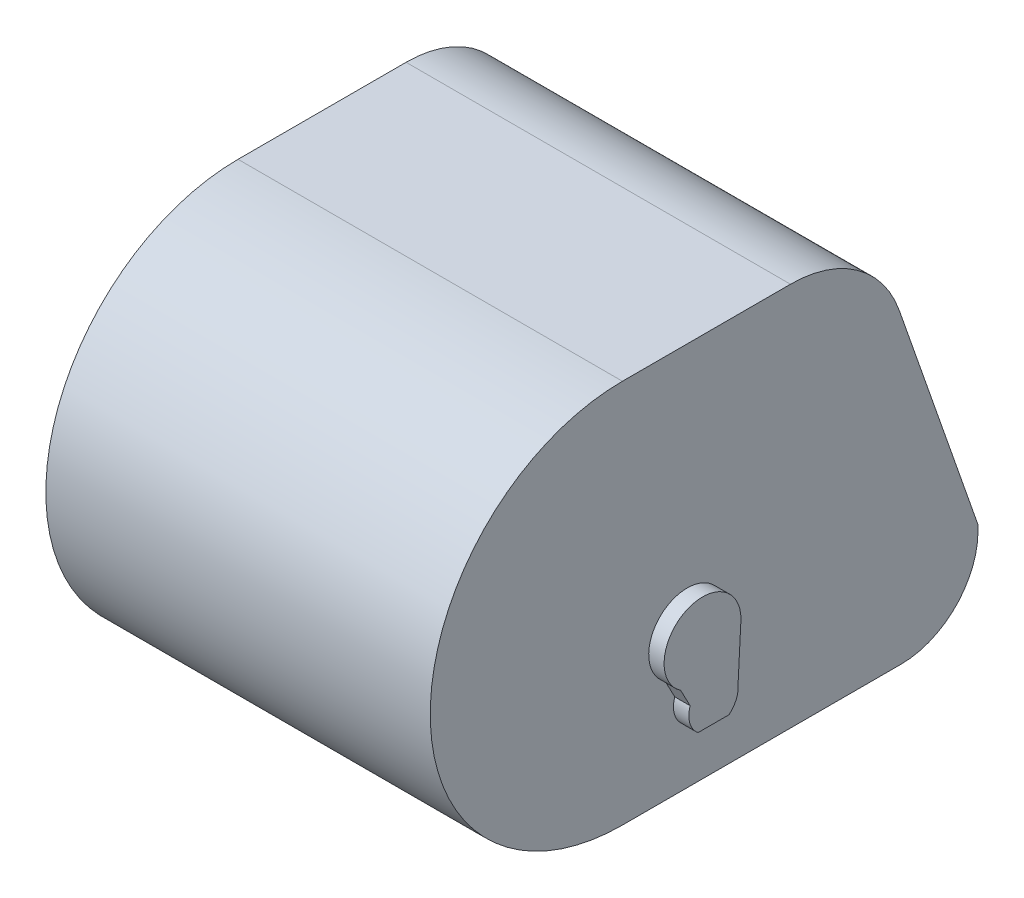
ISO-10303-21;
HEADER;
FILE_DESCRIPTION(('STEP AP214'),'2;1');
FILE_NAME('part.step','',(''),(''),'','','');
FILE_SCHEMA(('AUTOMOTIVE_DESIGN { 1 0 10303 214 1 1 1 1 }'));
ENDSEC;
DATA;
#1=APPLICATION_CONTEXT('core data for automotive mechanical design processes');
#2=APPLICATION_PROTOCOL_DEFINITION('international standard','automotive_design',2000,#1);
#3=PRODUCT_CONTEXT('',#1,'mechanical');
#4=PRODUCT('Part','Part','',(#3));
#5=PRODUCT_RELATED_PRODUCT_CATEGORY('part','',(#4));
#6=PRODUCT_DEFINITION_FORMATION('','',#4);
#7=PRODUCT_DEFINITION_CONTEXT('part definition',#1,'design');
#8=PRODUCT_DEFINITION('design','',#6,#7);
#9=PRODUCT_DEFINITION_SHAPE('','',#8);
#10=(LENGTH_UNIT() NAMED_UNIT(*) SI_UNIT(.MILLI.,.METRE.));
#11=(NAMED_UNIT(*) PLANE_ANGLE_UNIT() SI_UNIT($,.RADIAN.));
#12=(NAMED_UNIT(*) SI_UNIT($,.STERADIAN.) SOLID_ANGLE_UNIT());
#13=UNCERTAINTY_MEASURE_WITH_UNIT(LENGTH_MEASURE(1.E-05),#10,'distance_accuracy_value','');
#14=(GEOMETRIC_REPRESENTATION_CONTEXT(3) GLOBAL_UNCERTAINTY_ASSIGNED_CONTEXT((#13)) GLOBAL_UNIT_ASSIGNED_CONTEXT((#10,
#11,#12)) REPRESENTATION_CONTEXT('',''));
#15=CARTESIAN_POINT('',(0.,0.,0.));
#16=DIRECTION('',(0.,0.,1.));
#17=DIRECTION('',(1.,0.,0.));
#18=AXIS2_PLACEMENT_3D('',#15,#16,#17);
#19=CARTESIAN_POINT('',(-50.,0.,25.));
#20=DIRECTION('',(1.,0.,0.));
#21=DIRECTION('',(0.,0.,-1.));
#22=AXIS2_PLACEMENT_3D('',#19,#20,#21);
#23=CYLINDRICAL_SURFACE('',#22,50.);
#24=DIRECTION('',(1.,0.,0.));
#25=VECTOR('',#24,1.);
#26=CARTESIAN_POINT('',(-50.,-50.,25.));
#27=LINE('',#26,#25);
#28=CARTESIAN_POINT('',(-50.,-50.,25.));
#29=VERTEX_POINT('',#28);
#30=CARTESIAN_POINT('',(50.,-50.,25.));
#31=VERTEX_POINT('',#30);
#32=EDGE_CURVE('E348',#29,#31,#27,.T.);
#33=ORIENTED_EDGE('',*,*,#32,.T.);
#34=CARTESIAN_POINT('',(50.,0.,25.));
#35=DIRECTION('',(1.,0.,0.));
#36=DIRECTION('',(0.,0.,-1.));
#37=AXIS2_PLACEMENT_3D('',#34,#35,#36);
#38=CIRCLE('',#37,50.);
#39=CARTESIAN_POINT('',(50.,50.,25.));
#40=VERTEX_POINT('',#39);
#41=EDGE_CURVE('E313',#40,#31,#38,.T.);
#42=ORIENTED_EDGE('',*,*,#41,.F.);
#43=DIRECTION('',(1.,0.,0.));
#44=VECTOR('',#43,1.);
#45=CARTESIAN_POINT('',(-50.,50.,25.));
#46=LINE('',#45,#44);
#47=CARTESIAN_POINT('',(-50.,50.,25.));
#48=VERTEX_POINT('',#47);
#49=EDGE_CURVE('E349',#48,#40,#46,.T.);
#50=ORIENTED_EDGE('',*,*,#49,.F.);
#51=CARTESIAN_POINT('',(-50.,0.,25.));
#52=DIRECTION('',(1.,0.,0.));
#53=DIRECTION('',(0.,0.,-1.));
#54=AXIS2_PLACEMENT_3D('',#51,#52,#53);
#55=CIRCLE('',#54,50.);
#56=EDGE_CURVE('E330',#48,#29,#55,.T.);
#57=ORIENTED_EDGE('',*,*,#56,.T.);
#58=EDGE_LOOP('',(#33,#42,#50,#57));
#59=FACE_BOUND('',#58,.T.);
#60=ADVANCED_FACE('F47',(#59),#23,.T.);
#61=CARTESIAN_POINT('',(-50.,50.,0.));
#62=DIRECTION('',(0.,-1.,0.));
#63=DIRECTION('',(0.,0.,-1.));
#64=AXIS2_PLACEMENT_3D('',#61,#62,#63);
#65=PLANE('',#64);
#66=DIRECTION('',(0.,0.,-1.));
#67=VECTOR('',#66,1.);
#68=CARTESIAN_POINT('',(50.,50.,0.));
#69=LINE('',#68,#67);
#70=CARTESIAN_POINT('',(50.,50.,-18.7155698493744));
#71=VERTEX_POINT('',#70);
#72=EDGE_CURVE('E326',#40,#71,#69,.T.);
#73=ORIENTED_EDGE('',*,*,#72,.T.);
#74=DIRECTION('',(1.,0.,0.));
#75=VECTOR('',#74,1.);
#76=CARTESIAN_POINT('',(-50.,50.,-18.7155698493744));
#77=LINE('',#76,#75);
#78=CARTESIAN_POINT('',(-50.,50.,-18.7155698493744));
#79=VERTEX_POINT('',#78);
#80=EDGE_CURVE('E365',#71,#79,#77,.F.);
#81=ORIENTED_EDGE('',*,*,#80,.T.);
#82=DIRECTION('',(0.,0.,-1.));
#83=VECTOR('',#82,1.);
#84=CARTESIAN_POINT('',(-50.,50.,0.));
#85=LINE('',#84,#83);
#86=EDGE_CURVE('E344',#48,#79,#85,.T.);
#87=ORIENTED_EDGE('',*,*,#86,.F.);
#88=ORIENTED_EDGE('',*,*,#49,.T.);
#89=EDGE_LOOP('',(#73,#81,#87,#88));
#90=FACE_BOUND('',#89,.T.);
#91=ADVANCED_FACE('F408',(#90),#65,.F.);
#92=CARTESIAN_POINT('',(-50.,17.9287305122494,-51.2249443207127));
#93=DIRECTION('',(0.,-0.330350424728106,0.943858356366017));
#94=DIRECTION('',(0.,-0.943858356366017,-0.330350424728106));
#95=AXIS2_PLACEMENT_3D('',#92,#93,#94);
#96=PLANE('',#95);
#97=DIRECTION('',(0.,-0.943858356366018,-0.330350424728106));
#98=VECTOR('',#97,1.);
#99=CARTESIAN_POINT('',(-50.,17.9287305122494,-51.2249443207127));
#100=LINE('',#99,#98);
#101=CARTESIAN_POINT('',(-50.,29.9105127418432,-47.0313205403549));
#102=VERTEX_POINT('',#101);
#103=CARTESIAN_POINT('',(-50.,-28.5714285714286,-67.5));
#104=VERTEX_POINT('',#103);
#105=EDGE_CURVE('E341',#102,#104,#100,.T.);
#106=ORIENTED_EDGE('',*,*,#105,.F.);
#107=DIRECTION('',(1.,0.,0.));
#108=VECTOR('',#107,1.);
#109=CARTESIAN_POINT('',(-50.,29.9105127418432,-47.0313205403549));
#110=LINE('',#109,#108);
#111=CARTESIAN_POINT('',(50.,29.9105127418432,-47.0313205403549));
#112=VERTEX_POINT('',#111);
#113=EDGE_CURVE('E352',#102,#112,#110,.T.);
#114=ORIENTED_EDGE('',*,*,#113,.T.);
#115=DIRECTION('',(0.,-0.943858356366018,-0.330350424728106));
#116=VECTOR('',#115,1.);
#117=CARTESIAN_POINT('',(50.,17.9287305122494,-51.2249443207127));
#118=LINE('',#117,#116);
#119=CARTESIAN_POINT('',(50.,-28.5714285714286,-67.5));
#120=VERTEX_POINT('',#119);
#121=EDGE_CURVE('E323',#112,#120,#118,.T.);
#122=ORIENTED_EDGE('',*,*,#121,.T.);
#123=DIRECTION('',(1.,0.,0.));
#124=VECTOR('',#123,1.);
#125=CARTESIAN_POINT('',(-50.,-28.5714285714286,-67.5));
#126=LINE('',#125,#124);
#127=EDGE_CURVE('E353',#104,#120,#126,.T.);
#128=ORIENTED_EDGE('',*,*,#127,.F.);
#129=EDGE_LOOP('',(#106,#114,#122,#128));
#130=FACE_BOUND('',#129,.T.);
#131=ADVANCED_FACE('F414',(#130),#96,.F.);
#132=CARTESIAN_POINT('',(-50.,0.,-67.5));
#133=DIRECTION('',(0.,0.,1.));
#134=DIRECTION('',(0.,-1.,0.));
#135=AXIS2_PLACEMENT_3D('',#132,#133,#134);
#136=PLANE('',#135);
#137=DIRECTION('',(0.,-1.,0.));
#138=VECTOR('',#137,1.);
#139=CARTESIAN_POINT('',(50.,0.,-67.5));
#140=LINE('',#139,#138);
#141=CARTESIAN_POINT('',(50.,-30.,-67.5));
#142=VERTEX_POINT('',#141);
#143=EDGE_CURVE('E320',#120,#142,#140,.T.);
#144=ORIENTED_EDGE('',*,*,#143,.T.);
#145=DIRECTION('',(1.,0.,0.));
#146=VECTOR('',#145,1.);
#147=CARTESIAN_POINT('',(-50.,-30.,-67.5));
#148=LINE('',#147,#146);
#149=CARTESIAN_POINT('',(-50.,-30.,-67.5));
#150=VERTEX_POINT('',#149);
#151=EDGE_CURVE('E56',#142,#150,#148,.F.);
#152=ORIENTED_EDGE('',*,*,#151,.T.);
#153=DIRECTION('',(0.,-1.,0.));
#154=VECTOR('',#153,1.);
#155=CARTESIAN_POINT('',(-50.,0.,-67.5));
#156=LINE('',#155,#154);
#157=EDGE_CURVE('E338',#104,#150,#156,.T.);
#158=ORIENTED_EDGE('',*,*,#157,.F.);
#159=ORIENTED_EDGE('',*,*,#127,.T.);
#160=EDGE_LOOP('',(#144,#152,#158,#159));
#161=FACE_BOUND('',#160,.T.);
#162=ADVANCED_FACE('F444',(#161),#136,.F.);
#163=CARTESIAN_POINT('',(-50.,-50.,0.));
#164=DIRECTION('',(0.,-1.,0.));
#165=DIRECTION('',(0.,0.,-1.));
#166=AXIS2_PLACEMENT_3D('',#163,#164,#165);
#167=PLANE('',#166);
#168=DIRECTION('',(0.,0.,-1.));
#169=VECTOR('',#168,1.);
#170=CARTESIAN_POINT('',(-50.,-50.,0.));
#171=LINE('',#170,#169);
#172=CARTESIAN_POINT('',(-50.,-50.,-47.5));
#173=VERTEX_POINT('',#172);
#174=EDGE_CURVE('E334',#29,#173,#171,.T.);
#175=ORIENTED_EDGE('',*,*,#174,.T.);
#176=DIRECTION('',(1.,0.,0.));
#177=VECTOR('',#176,1.);
#178=CARTESIAN_POINT('',(50.,-50.,-47.5));
#179=LINE('',#178,#177);
#180=CARTESIAN_POINT('',(50.,-50.,-47.5));
#181=VERTEX_POINT('',#180);
#182=EDGE_CURVE('E371',#173,#181,#179,.T.);
#183=ORIENTED_EDGE('',*,*,#182,.T.);
#184=DIRECTION('',(0.,0.,-1.));
#185=VECTOR('',#184,1.);
#186=CARTESIAN_POINT('',(50.,-50.,0.));
#187=LINE('',#186,#185);
#188=EDGE_CURVE('E317',#31,#181,#187,.T.);
#189=ORIENTED_EDGE('',*,*,#188,.F.);
#190=ORIENTED_EDGE('',*,*,#32,.F.);
#191=EDGE_LOOP('',(#175,#183,#189,#190));
#192=FACE_BOUND('',#191,.T.);
#193=ADVANCED_FACE('F418',(#192),#167,.T.);
#194=CARTESIAN_POINT('',(-50.,0.,0.));
#195=DIRECTION('',(1.,0.,0.));
#196=DIRECTION('',(0.,0.,-1.));
#197=AXIS2_PLACEMENT_3D('',#194,#195,#196);
#198=PLANE('',#197);
#199=DIRECTION('',(0.,-0.998606059396649,0.0527819868543855));
#200=VECTOR('',#199,1.);
#201=CARTESIAN_POINT('',(-50.,-0.138617613155003,-2.62256873386694));
#202=LINE('',#201,#200);
#203=CARTESIAN_POINT('',(-50.,-15.,-1.83706049225424));
#204=VERTEX_POINT('',#203);
#205=CARTESIAN_POINT('',(-50.,-29.4030529426239,-1.07577755798092));
#206=VERTEX_POINT('',#205);
#207=EDGE_CURVE('E227',#204,#206,#202,.T.);
#208=ORIENTED_EDGE('',*,*,#207,.F.);
#209=CARTESIAN_POINT('',(-50.,-15.,8.16293950774576));
#210=DIRECTION('',(1.,0.,0.));
#211=DIRECTION('',(0.,0.,-1.));
#212=AXIS2_PLACEMENT_3D('',#209,#210,#211);
#213=CIRCLE('',#212,10.);
#214=CARTESIAN_POINT('',(-50.,-23.2277046201165,13.8466774225439));
#215=VERTEX_POINT('',#214);
#216=EDGE_CURVE('E186',#204,#215,#213,.T.);
#217=ORIENTED_EDGE('',*,*,#216,.T.);
#218=DIRECTION('',(0.,-0.885543277169393,-0.464556890229918));
#219=VECTOR('',#218,1.);
#220=CARTESIAN_POINT('',(-50.,-10.7091616290402,20.4139176151782));
#221=LINE('',#220,#219);
#222=CARTESIAN_POINT('',(-50.,-27.9239305604571,11.3830325901476));
#223=VERTEX_POINT('',#222);
#224=EDGE_CURVE('E208',#215,#223,#221,.T.);
#225=ORIENTED_EDGE('',*,*,#224,.T.);
#226=CARTESIAN_POINT('',(-50.,-30.,5.31229910997899));
#227=DIRECTION('',(1.,0.,0.));
#228=DIRECTION('',(0.,0.,-1.));
#229=AXIS2_PLACEMENT_3D('',#226,#227,#228);
#230=CIRCLE('',#229,6.41590751998841);
#231=CARTESIAN_POINT('',(-50.,-35.,9.33273059242509));
#232=VERTEX_POINT('',#231);
#233=EDGE_CURVE('E212',#223,#232,#230,.T.);
#234=ORIENTED_EDGE('',*,*,#233,.T.);
#235=DIRECTION('',(0.,0.,-1.));
#236=VECTOR('',#235,1.);
#237=CARTESIAN_POINT('',(-50.,-35.,0.));
#238=LINE('',#237,#236);
#239=CARTESIAN_POINT('',(-50.,-35.,1.29186762753289));
#240=VERTEX_POINT('',#239);
#241=EDGE_CURVE('E234',#232,#240,#238,.T.);
#242=ORIENTED_EDGE('',*,*,#241,.T.);
#243=EDGE_CURVE('E230',#240,#206,#230,.T.);
#244=ORIENTED_EDGE('',*,*,#243,.T.);
#245=EDGE_LOOP('',(#208,#217,#225,#234,#242,#244));
#246=FACE_BOUND('',#245,.T.);
#247=ORIENTED_EDGE('',*,*,#157,.T.);
#248=CARTESIAN_POINT('',(-50.,-30.,-47.5));
#249=DIRECTION('',(1.,0.,0.));
#250=DIRECTION('',(0.,0.,-1.));
#251=AXIS2_PLACEMENT_3D('',#248,#249,#250);
#252=CIRCLE('',#251,20.);
#253=EDGE_CURVE('E11',#150,#173,#252,.F.);
#254=ORIENTED_EDGE('',*,*,#253,.T.);
#255=ORIENTED_EDGE('',*,*,#174,.F.);
#256=ORIENTED_EDGE('',*,*,#56,.F.);
#257=ORIENTED_EDGE('',*,*,#86,.T.);
#258=CARTESIAN_POINT('',(-50.,20.,-18.7155698493744));
#259=DIRECTION('',(1.,0.,0.));
#260=DIRECTION('',(0.,0.,-1.));
#261=AXIS2_PLACEMENT_3D('',#258,#259,#260);
#262=CIRCLE('',#261,30.);
#263=EDGE_CURVE('E368',#79,#102,#262,.F.);
#264=ORIENTED_EDGE('',*,*,#263,.T.);
#265=ORIENTED_EDGE('',*,*,#105,.T.);
#266=EDGE_LOOP('',(#247,#254,#255,#256,#257,#264,#265));
#267=FACE_BOUND('',#266,.T.);
#268=ADVANCED_FACE('F391',(#246,#267),#198,.F.);
#269=CARTESIAN_POINT('',(50.,0.,0.));
#270=DIRECTION('',(1.,0.,0.));
#271=DIRECTION('',(0.,0.,-1.));
#272=AXIS2_PLACEMENT_3D('',#269,#270,#271);
#273=PLANE('',#272);
#274=CARTESIAN_POINT('',(50.,-15.,8.16293950774576));
#275=DIRECTION('',(1.,0.,0.));
#276=DIRECTION('',(0.,0.,-1.));
#277=AXIS2_PLACEMENT_3D('',#274,#275,#276);
#278=CIRCLE('',#277,10.);
#279=CARTESIAN_POINT('',(50.,-15.,-1.83706049225424));
#280=VERTEX_POINT('',#279);
#281=CARTESIAN_POINT('',(50.,-23.2277046201165,13.8466774225439));
#282=VERTEX_POINT('',#281);
#283=EDGE_CURVE('E191',#280,#282,#278,.T.);
#284=ORIENTED_EDGE('',*,*,#283,.F.);
#285=DIRECTION('',(0.,-0.998606059396649,0.0527819868543855));
#286=VECTOR('',#285,1.);
#287=CARTESIAN_POINT('',(50.,-0.138617613155003,-2.62256873386694));
#288=LINE('',#287,#286);
#289=CARTESIAN_POINT('',(50.,-29.4030529426239,-1.07577755798092));
#290=VERTEX_POINT('',#289);
#291=EDGE_CURVE('E257',#280,#290,#288,.T.);
#292=ORIENTED_EDGE('',*,*,#291,.T.);
#293=CARTESIAN_POINT('',(50.,-30.,5.31229910997899));
#294=DIRECTION('',(1.,0.,0.));
#295=DIRECTION('',(0.,0.,-1.));
#296=AXIS2_PLACEMENT_3D('',#293,#294,#295);
#297=CIRCLE('',#296,6.41590751998841);
#298=CARTESIAN_POINT('',(50.,-35.,1.29186762753289));
#299=VERTEX_POINT('',#298);
#300=EDGE_CURVE('E284',#299,#290,#297,.T.);
#301=ORIENTED_EDGE('',*,*,#300,.F.);
#302=DIRECTION('',(0.,0.,-1.));
#303=VECTOR('',#302,1.);
#304=CARTESIAN_POINT('',(50.,-35.,0.));
#305=LINE('',#304,#303);
#306=CARTESIAN_POINT('',(50.,-35.,9.33273059242509));
#307=VERTEX_POINT('',#306);
#308=EDGE_CURVE('E283',#307,#299,#305,.T.);
#309=ORIENTED_EDGE('',*,*,#308,.F.);
#310=CARTESIAN_POINT('',(50.,-27.9239305604571,11.3830325901476));
#311=VERTEX_POINT('',#310);
#312=EDGE_CURVE('E279',#311,#307,#297,.T.);
#313=ORIENTED_EDGE('',*,*,#312,.F.);
#314=DIRECTION('',(0.,-0.885543277169393,-0.464556890229918));
#315=VECTOR('',#314,1.);
#316=CARTESIAN_POINT('',(50.,-10.7091616290402,20.4139176151782));
#317=LINE('',#316,#315);
#318=EDGE_CURVE('E275',#282,#311,#317,.T.);
#319=ORIENTED_EDGE('',*,*,#318,.F.);
#320=EDGE_LOOP('',(#284,#292,#301,#309,#313,#319));
#321=FACE_BOUND('',#320,.T.);
#322=ORIENTED_EDGE('',*,*,#188,.T.);
#323=CARTESIAN_POINT('',(50.,-30.,-47.5));
#324=DIRECTION('',(1.,0.,0.));
#325=DIRECTION('',(0.,0.,-1.));
#326=AXIS2_PLACEMENT_3D('',#323,#324,#325);
#327=CIRCLE('',#326,20.);
#328=EDGE_CURVE('E70',#181,#142,#327,.T.);
#329=ORIENTED_EDGE('',*,*,#328,.T.);
#330=ORIENTED_EDGE('',*,*,#143,.F.);
#331=ORIENTED_EDGE('',*,*,#121,.F.);
#332=CARTESIAN_POINT('',(50.,20.,-18.7155698493744));
#333=DIRECTION('',(1.,0.,0.));
#334=DIRECTION('',(0.,0.,-1.));
#335=AXIS2_PLACEMENT_3D('',#332,#333,#334);
#336=CIRCLE('',#335,30.);
#337=EDGE_CURVE('E362',#112,#71,#336,.T.);
#338=ORIENTED_EDGE('',*,*,#337,.T.);
#339=ORIENTED_EDGE('',*,*,#72,.F.);
#340=ORIENTED_EDGE('',*,*,#41,.T.);
#341=EDGE_LOOP('',(#322,#329,#330,#331,#338,#339,#340));
#342=FACE_BOUND('',#341,.T.);
#343=ADVANCED_FACE('F423',(#321,#342),#273,.T.);
#344=CARTESIAN_POINT('',(-50.,20.,-18.7155698493744));
#345=DIRECTION('',(1.,0.,0.));
#346=DIRECTION('',(0.,0.,-1.));
#347=AXIS2_PLACEMENT_3D('',#344,#345,#346);
#348=CYLINDRICAL_SURFACE('',#347,30.);
#349=ORIENTED_EDGE('',*,*,#263,.F.);
#350=ORIENTED_EDGE('',*,*,#80,.F.);
#351=ORIENTED_EDGE('',*,*,#337,.F.);
#352=ORIENTED_EDGE('',*,*,#113,.F.);
#353=EDGE_LOOP('',(#349,#350,#351,#352));
#354=FACE_BOUND('',#353,.T.);
#355=ADVANCED_FACE('F420',(#354),#348,.T.);
#356=CARTESIAN_POINT('',(54.,-15.,8.16293950774576));
#357=DIRECTION('',(-1.,0.,0.));
#358=DIRECTION('',(0.,0.,1.));
#359=AXIS2_PLACEMENT_3D('',#356,#357,#358);
#360=CYLINDRICAL_SURFACE('',#359,10.);
#361=ORIENTED_EDGE('',*,*,#283,.T.);
#362=DIRECTION('',(-1.,0.,0.));
#363=VECTOR('',#362,1.);
#364=CARTESIAN_POINT('',(54.,-23.2277046201165,13.8466774225439));
#365=LINE('',#364,#363);
#366=CARTESIAN_POINT('',(54.,-23.2277046201165,13.8466774225439));
#367=VERTEX_POINT('',#366);
#368=EDGE_CURVE('E309',#367,#282,#365,.T.);
#369=ORIENTED_EDGE('',*,*,#368,.F.);
#370=CARTESIAN_POINT('',(54.,-15.,8.16293950774576));
#371=DIRECTION('',(1.,0.,0.));
#372=DIRECTION('',(0.,0.,-1.));
#373=AXIS2_PLACEMENT_3D('',#370,#371,#372);
#374=CIRCLE('',#373,10.);
#375=CARTESIAN_POINT('',(54.,-15.,-1.83706049225424));
#376=VERTEX_POINT('',#375);
#377=EDGE_CURVE('E252',#376,#367,#374,.T.);
#378=ORIENTED_EDGE('',*,*,#377,.F.);
#379=DIRECTION('',(-1.,0.,0.));
#380=VECTOR('',#379,1.);
#381=CARTESIAN_POINT('',(54.,-15.,-1.83706049225424));
#382=LINE('',#381,#380);
#383=EDGE_CURVE('E271',#376,#280,#382,.T.);
#384=ORIENTED_EDGE('',*,*,#383,.T.);
#385=EDGE_LOOP('',(#361,#369,#378,#384));
#386=FACE_BOUND('',#385,.T.);
#387=ADVANCED_FACE('F422',(#386),#360,.T.);
#388=CARTESIAN_POINT('',(54.,-10.7091616290402,20.4139176151782));
#389=DIRECTION('',(0.,0.464556890229918,-0.885543277169393));
#390=DIRECTION('',(0.,0.885543277169393,0.464556890229918));
#391=AXIS2_PLACEMENT_3D('',#388,#389,#390);
#392=PLANE('',#391);
#393=ORIENTED_EDGE('',*,*,#318,.T.);
#394=DIRECTION('',(-1.,0.,0.));
#395=VECTOR('',#394,1.);
#396=CARTESIAN_POINT('',(54.,-27.9239305604571,11.3830325901476));
#397=LINE('',#396,#395);
#398=CARTESIAN_POINT('',(54.,-27.9239305604571,11.3830325901476));
#399=VERTEX_POINT('',#398);
#400=EDGE_CURVE('E305',#399,#311,#397,.T.);
#401=ORIENTED_EDGE('',*,*,#400,.F.);
#402=DIRECTION('',(0.,-0.885543277169393,-0.464556890229918));
#403=VECTOR('',#402,1.);
#404=CARTESIAN_POINT('',(54.,-10.7091616290402,20.4139176151782));
#405=LINE('',#404,#403);
#406=EDGE_CURVE('E256',#367,#399,#405,.T.);
#407=ORIENTED_EDGE('',*,*,#406,.F.);
#408=ORIENTED_EDGE('',*,*,#368,.T.);
#409=EDGE_LOOP('',(#393,#401,#407,#408));
#410=FACE_BOUND('',#409,.T.);
#411=ADVANCED_FACE('F429',(#410),#392,.F.);
#412=CARTESIAN_POINT('',(54.,-30.,5.31229910997899));
#413=DIRECTION('',(-1.,0.,0.));
#414=DIRECTION('',(0.,0.,1.));
#415=AXIS2_PLACEMENT_3D('',#412,#413,#414);
#416=CYLINDRICAL_SURFACE('',#415,6.41590751998841);
#417=ORIENTED_EDGE('',*,*,#312,.T.);
#418=DIRECTION('',(-1.,0.,0.));
#419=VECTOR('',#418,1.);
#420=CARTESIAN_POINT('',(54.,-35.,9.33273059242509));
#421=LINE('',#420,#419);
#422=CARTESIAN_POINT('',(54.,-35.,9.33273059242509));
#423=VERTEX_POINT('',#422);
#424=EDGE_CURVE('E301',#423,#307,#421,.T.);
#425=ORIENTED_EDGE('',*,*,#424,.F.);
#426=CARTESIAN_POINT('',(54.,-30.,5.31229910997899));
#427=DIRECTION('',(1.,0.,0.));
#428=DIRECTION('',(0.,0.,-1.));
#429=AXIS2_PLACEMENT_3D('',#426,#427,#428);
#430=CIRCLE('',#429,6.41590751998841);
#431=EDGE_CURVE('E260',#399,#423,#430,.T.);
#432=ORIENTED_EDGE('',*,*,#431,.F.);
#433=ORIENTED_EDGE('',*,*,#400,.T.);
#434=EDGE_LOOP('',(#417,#425,#432,#433));
#435=FACE_BOUND('',#434,.T.);
#436=ADVANCED_FACE('F466',(#435),#416,.T.);
#437=CARTESIAN_POINT('',(54.,-35.,0.));
#438=DIRECTION('',(0.,1.,0.));
#439=DIRECTION('',(0.,0.,1.));
#440=AXIS2_PLACEMENT_3D('',#437,#438,#439);
#441=PLANE('',#440);
#442=ORIENTED_EDGE('',*,*,#308,.T.);
#443=DIRECTION('',(-1.,0.,0.));
#444=VECTOR('',#443,1.);
#445=CARTESIAN_POINT('',(54.,-35.,1.29186762753289));
#446=LINE('',#445,#444);
#447=CARTESIAN_POINT('',(54.,-35.,1.29186762753289));
#448=VERTEX_POINT('',#447);
#449=EDGE_CURVE('E297',#448,#299,#446,.T.);
#450=ORIENTED_EDGE('',*,*,#449,.F.);
#451=DIRECTION('',(0.,0.,-1.));
#452=VECTOR('',#451,1.);
#453=CARTESIAN_POINT('',(54.,-35.,0.));
#454=LINE('',#453,#452);
#455=EDGE_CURVE('E263',#423,#448,#454,.T.);
#456=ORIENTED_EDGE('',*,*,#455,.F.);
#457=ORIENTED_EDGE('',*,*,#424,.T.);
#458=EDGE_LOOP('',(#442,#450,#456,#457));
#459=FACE_BOUND('',#458,.T.);
#460=ADVANCED_FACE('F468',(#459),#441,.F.);
#461=ORIENTED_EDGE('',*,*,#300,.T.);
#462=DIRECTION('',(-1.,0.,0.));
#463=VECTOR('',#462,1.);
#464=CARTESIAN_POINT('',(54.,-29.4030529426239,-1.07577755798092));
#465=LINE('',#464,#463);
#466=CARTESIAN_POINT('',(54.,-29.4030529426239,-1.07577755798092));
#467=VERTEX_POINT('',#466);
#468=EDGE_CURVE('E293',#467,#290,#465,.T.);
#469=ORIENTED_EDGE('',*,*,#468,.F.);
#470=EDGE_CURVE('E264',#448,#467,#430,.T.);
#471=ORIENTED_EDGE('',*,*,#470,.F.);
#472=ORIENTED_EDGE('',*,*,#449,.T.);
#473=EDGE_LOOP('',(#461,#469,#471,#472));
#474=FACE_BOUND('',#473,.T.);
#475=ADVANCED_FACE('F471',(#474),#416,.T.);
#476=CARTESIAN_POINT('',(54.,-0.138617613155003,-2.62256873386694));
#477=DIRECTION('',(0.,-0.0527819868543855,-0.998606059396649));
#478=DIRECTION('',(0.,0.998606059396649,-0.0527819868543855));
#479=AXIS2_PLACEMENT_3D('',#476,#477,#478);
#480=PLANE('',#479);
#481=ORIENTED_EDGE('',*,*,#291,.F.);
#482=ORIENTED_EDGE('',*,*,#383,.F.);
#483=DIRECTION('',(0.,-0.998606059396649,0.0527819868543855));
#484=VECTOR('',#483,1.);
#485=CARTESIAN_POINT('',(54.,-0.138617613155003,-2.62256873386694));
#486=LINE('',#485,#484);
#487=EDGE_CURVE('E267',#376,#467,#486,.T.);
#488=ORIENTED_EDGE('',*,*,#487,.T.);
#489=ORIENTED_EDGE('',*,*,#468,.T.);
#490=EDGE_LOOP('',(#481,#482,#488,#489));
#491=FACE_BOUND('',#490,.T.);
#492=ADVANCED_FACE('F475',(#491),#480,.T.);
#493=CARTESIAN_POINT('',(54.,0.,0.));
#494=DIRECTION('',(1.,0.,0.));
#495=DIRECTION('',(0.,0.,-1.));
#496=AXIS2_PLACEMENT_3D('',#493,#494,#495);
#497=PLANE('',#496);
#498=ORIENTED_EDGE('',*,*,#377,.T.);
#499=ORIENTED_EDGE('',*,*,#406,.T.);
#500=ORIENTED_EDGE('',*,*,#431,.T.);
#501=ORIENTED_EDGE('',*,*,#455,.T.);
#502=ORIENTED_EDGE('',*,*,#470,.T.);
#503=ORIENTED_EDGE('',*,*,#487,.F.);
#504=EDGE_LOOP('',(#498,#499,#500,#501,#502,#503));
#505=FACE_BOUND('',#504,.T.);
#506=ADVANCED_FACE('F479',(#505),#497,.T.);
#507=CARTESIAN_POINT('',(-54.,-15.,8.16293950774576));
#508=DIRECTION('',(1.,0.,0.));
#509=DIRECTION('',(0.,0.,-1.));
#510=AXIS2_PLACEMENT_3D('',#507,#508,#509);
#511=CYLINDRICAL_SURFACE('',#510,10.);
#512=ORIENTED_EDGE('',*,*,#216,.F.);
#513=DIRECTION('',(1.,0.,0.));
#514=VECTOR('',#513,1.);
#515=CARTESIAN_POINT('',(-54.,-15.,-1.83706049225424));
#516=LINE('',#515,#514);
#517=CARTESIAN_POINT('',(-54.,-15.,-1.83706049225424));
#518=VERTEX_POINT('',#517);
#519=EDGE_CURVE('E179',#518,#204,#516,.T.);
#520=ORIENTED_EDGE('',*,*,#519,.F.);
#521=CARTESIAN_POINT('',(-54.,-15.,8.16293950774576));
#522=DIRECTION('',(1.,0.,0.));
#523=DIRECTION('',(0.,0.,-1.));
#524=AXIS2_PLACEMENT_3D('',#521,#522,#523);
#525=CIRCLE('',#524,10.);
#526=CARTESIAN_POINT('',(-54.,-23.2277046201165,13.8466774225439));
#527=VERTEX_POINT('',#526);
#528=EDGE_CURVE('E183',#518,#527,#525,.T.);
#529=ORIENTED_EDGE('',*,*,#528,.T.);
#530=DIRECTION('',(1.,0.,0.));
#531=VECTOR('',#530,1.);
#532=CARTESIAN_POINT('',(-54.,-23.2277046201165,13.8466774225439));
#533=LINE('',#532,#531);
#534=EDGE_CURVE('E224',#527,#215,#533,.T.);
#535=ORIENTED_EDGE('',*,*,#534,.T.);
#536=EDGE_LOOP('',(#512,#520,#529,#535));
#537=FACE_BOUND('',#536,.T.);
#538=ADVANCED_FACE('F181',(#537),#511,.T.);
#539=CARTESIAN_POINT('',(-54.,-0.138617613155003,-2.62256873386694));
#540=DIRECTION('',(0.,0.0527819868543855,0.998606059396649));
#541=DIRECTION('',(0.,-0.998606059396649,0.0527819868543855));
#542=AXIS2_PLACEMENT_3D('',#539,#540,#541);
#543=PLANE('',#542);
#544=ORIENTED_EDGE('',*,*,#207,.T.);
#545=DIRECTION('',(1.,0.,0.));
#546=VECTOR('',#545,1.);
#547=CARTESIAN_POINT('',(-54.,-29.4030529426239,-1.07577755798092));
#548=LINE('',#547,#546);
#549=CARTESIAN_POINT('',(-54.,-29.4030529426239,-1.07577755798092));
#550=VERTEX_POINT('',#549);
#551=EDGE_CURVE('E192',#550,#206,#548,.T.);
#552=ORIENTED_EDGE('',*,*,#551,.F.);
#553=DIRECTION('',(0.,-0.998606059396649,0.0527819868543855));
#554=VECTOR('',#553,1.);
#555=CARTESIAN_POINT('',(-54.,-0.138617613155003,-2.62256873386694));
#556=LINE('',#555,#554);
#557=EDGE_CURVE('E195',#518,#550,#556,.T.);
#558=ORIENTED_EDGE('',*,*,#557,.F.);
#559=ORIENTED_EDGE('',*,*,#519,.T.);
#560=EDGE_LOOP('',(#544,#552,#558,#559));
#561=FACE_BOUND('',#560,.T.);
#562=ADVANCED_FACE('F196',(#561),#543,.F.);
#563=CARTESIAN_POINT('',(-54.,-30.,5.31229910997899));
#564=DIRECTION('',(1.,0.,0.));
#565=DIRECTION('',(0.,0.,-1.));
#566=AXIS2_PLACEMENT_3D('',#563,#564,#565);
#567=CYLINDRICAL_SURFACE('',#566,6.41590751998841);
#568=ORIENTED_EDGE('',*,*,#243,.F.);
#569=DIRECTION('',(1.,0.,0.));
#570=VECTOR('',#569,1.);
#571=CARTESIAN_POINT('',(-54.,-35.,1.29186762753289));
#572=LINE('',#571,#570);
#573=CARTESIAN_POINT('',(-54.,-35.,1.29186762753289));
#574=VERTEX_POINT('',#573);
#575=EDGE_CURVE('E247',#574,#240,#572,.T.);
#576=ORIENTED_EDGE('',*,*,#575,.F.);
#577=CARTESIAN_POINT('',(-54.,-30.,5.31229910997899));
#578=DIRECTION('',(1.,0.,0.));
#579=DIRECTION('',(0.,0.,-1.));
#580=AXIS2_PLACEMENT_3D('',#577,#578,#579);
#581=CIRCLE('',#580,6.41590751998841);
#582=EDGE_CURVE('E201',#574,#550,#581,.T.);
#583=ORIENTED_EDGE('',*,*,#582,.T.);
#584=ORIENTED_EDGE('',*,*,#551,.T.);
#585=EDGE_LOOP('',(#568,#576,#583,#584));
#586=FACE_BOUND('',#585,.T.);
#587=ADVANCED_FACE('F395',(#586),#567,.T.);
#588=CARTESIAN_POINT('',(-54.,-35.,0.));
#589=DIRECTION('',(0.,-1.,0.));
#590=DIRECTION('',(0.,0.,-1.));
#591=AXIS2_PLACEMENT_3D('',#588,#589,#590);
#592=PLANE('',#591);
#593=ORIENTED_EDGE('',*,*,#241,.F.);
#594=DIRECTION('',(1.,0.,0.));
#595=VECTOR('',#594,1.);
#596=CARTESIAN_POINT('',(-54.,-35.,9.33273059242509));
#597=LINE('',#596,#595);
#598=CARTESIAN_POINT('',(-54.,-35.,9.33273059242509));
#599=VERTEX_POINT('',#598);
#600=EDGE_CURVE('E244',#599,#232,#597,.T.);
#601=ORIENTED_EDGE('',*,*,#600,.F.);
#602=DIRECTION('',(0.,0.,-1.));
#603=VECTOR('',#602,1.);
#604=CARTESIAN_POINT('',(-54.,-35.,0.));
#605=LINE('',#604,#603);
#606=EDGE_CURVE('E217',#599,#574,#605,.T.);
#607=ORIENTED_EDGE('',*,*,#606,.T.);
#608=ORIENTED_EDGE('',*,*,#575,.T.);
#609=EDGE_LOOP('',(#593,#601,#607,#608));
#610=FACE_BOUND('',#609,.T.);
#611=ADVANCED_FACE('F397',(#610),#592,.T.);
#612=ORIENTED_EDGE('',*,*,#233,.F.);
#613=DIRECTION('',(1.,0.,0.));
#614=VECTOR('',#613,1.);
#615=CARTESIAN_POINT('',(-54.,-27.9239305604571,11.3830325901476));
#616=LINE('',#615,#614);
#617=CARTESIAN_POINT('',(-54.,-27.9239305604571,11.3830325901476));
#618=VERTEX_POINT('',#617);
#619=EDGE_CURVE('E240',#618,#223,#616,.T.);
#620=ORIENTED_EDGE('',*,*,#619,.F.);
#621=EDGE_CURVE('E218',#618,#599,#581,.T.);
#622=ORIENTED_EDGE('',*,*,#621,.T.);
#623=ORIENTED_EDGE('',*,*,#600,.T.);
#624=EDGE_LOOP('',(#612,#620,#622,#623));
#625=FACE_BOUND('',#624,.T.);
#626=ADVANCED_FACE('F383',(#625),#567,.T.);
#627=CARTESIAN_POINT('',(-54.,-10.7091616290402,20.4139176151782));
#628=DIRECTION('',(0.,-0.464556890229918,0.885543277169393));
#629=DIRECTION('',(0.,-0.885543277169393,-0.464556890229918));
#630=AXIS2_PLACEMENT_3D('',#627,#628,#629);
#631=PLANE('',#630);
#632=ORIENTED_EDGE('',*,*,#224,.F.);
#633=ORIENTED_EDGE('',*,*,#534,.F.);
#634=DIRECTION('',(0.,-0.885543277169393,-0.464556890229918));
#635=VECTOR('',#634,1.);
#636=CARTESIAN_POINT('',(-54.,-10.7091616290402,20.4139176151782));
#637=LINE('',#636,#635);
#638=EDGE_CURVE('E206',#527,#618,#637,.T.);
#639=ORIENTED_EDGE('',*,*,#638,.T.);
#640=ORIENTED_EDGE('',*,*,#619,.T.);
#641=EDGE_LOOP('',(#632,#633,#639,#640));
#642=FACE_BOUND('',#641,.T.);
#643=ADVANCED_FACE('F388',(#642),#631,.T.);
#644=CARTESIAN_POINT('',(-54.,0.,0.));
#645=DIRECTION('',(-1.,0.,0.));
#646=DIRECTION('',(0.,0.,-1.));
#647=AXIS2_PLACEMENT_3D('',#644,#645,#646);
#648=PLANE('',#647);
#649=ORIENTED_EDGE('',*,*,#528,.F.);
#650=ORIENTED_EDGE('',*,*,#557,.T.);
#651=ORIENTED_EDGE('',*,*,#582,.F.);
#652=ORIENTED_EDGE('',*,*,#606,.F.);
#653=ORIENTED_EDGE('',*,*,#621,.F.);
#654=ORIENTED_EDGE('',*,*,#638,.F.);
#655=EDGE_LOOP('',(#649,#650,#651,#652,#653,#654));
#656=FACE_BOUND('',#655,.T.);
#657=ADVANCED_FACE('F203',(#656),#648,.T.);
#658=CARTESIAN_POINT('',(-50.,-30.,-47.5));
#659=DIRECTION('',(-1.,0.,0.));
#660=DIRECTION('',(0.,0.,1.));
#661=AXIS2_PLACEMENT_3D('',#658,#659,#660);
#662=CYLINDRICAL_SURFACE('',#661,20.);
#663=ORIENTED_EDGE('',*,*,#253,.F.);
#664=ORIENTED_EDGE('',*,*,#151,.F.);
#665=ORIENTED_EDGE('',*,*,#328,.F.);
#666=ORIENTED_EDGE('',*,*,#182,.F.);
#667=EDGE_LOOP('',(#663,#664,#665,#666));
#668=FACE_BOUND('',#667,.T.);
#669=ADVANCED_FACE('F49',(#668),#662,.T.);
#670=CLOSED_SHELL('',(#60,#91,#131,#162,#193,#268,#343,#355,#387,#411,#436,#460,#475,#492,#506,
#538,#562,#587,#611,#626,#643,#657,#669));
#671=MANIFOLD_SOLID_BREP('B2',#670);
#672=ADVANCED_BREP_SHAPE_REPRESENTATION('',(#18,#671),#14);
#673=SHAPE_DEFINITION_REPRESENTATION(#9,#672);
ENDSEC;
END-ISO-10303-21;
